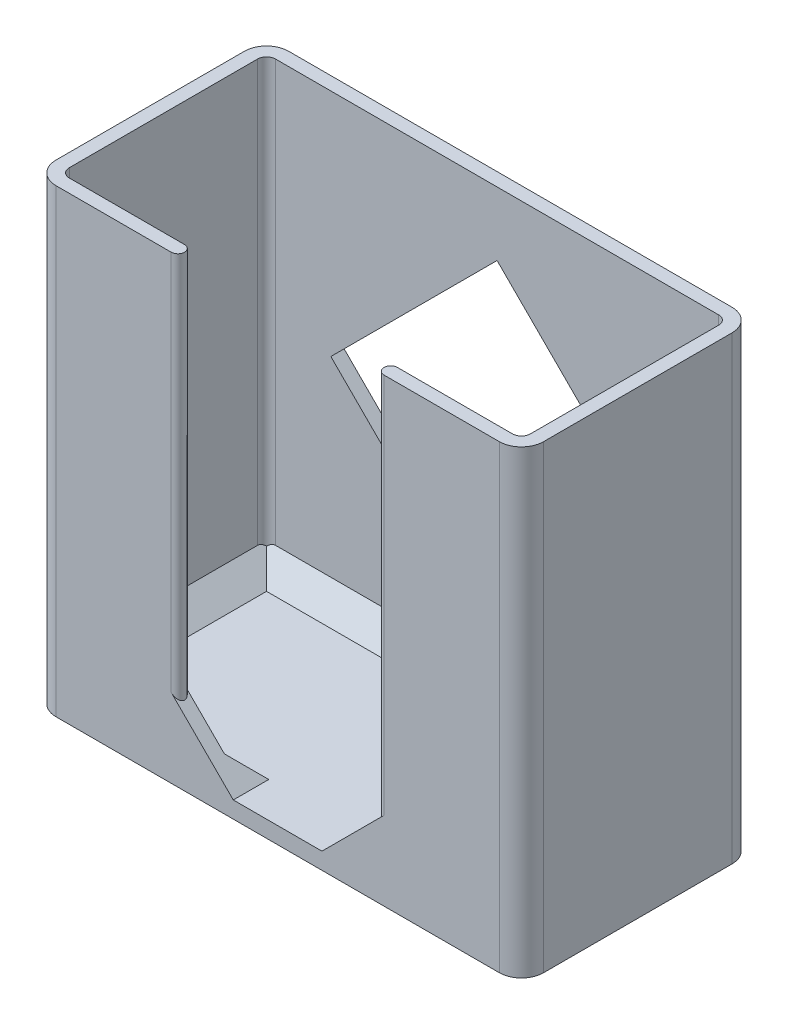
ISO-10303-21;
HEADER;
FILE_DESCRIPTION(('STEP AP214'),'2;1');
FILE_NAME('part.step','',(''),(''),'','','');
FILE_SCHEMA(('AUTOMOTIVE_DESIGN { 1 0 10303 214 1 1 1 1 }'));
ENDSEC;
DATA;
#1=APPLICATION_CONTEXT('core data for automotive mechanical design processes');
#2=APPLICATION_PROTOCOL_DEFINITION('international standard','automotive_design',2000,#1);
#3=PRODUCT_CONTEXT('',#1,'mechanical');
#4=PRODUCT('Part','Part','',(#3));
#5=PRODUCT_RELATED_PRODUCT_CATEGORY('part','',(#4));
#6=PRODUCT_DEFINITION_FORMATION('','',#4);
#7=PRODUCT_DEFINITION_CONTEXT('part definition',#1,'design');
#8=PRODUCT_DEFINITION('design','',#6,#7);
#9=PRODUCT_DEFINITION_SHAPE('','',#8);
#10=(LENGTH_UNIT() NAMED_UNIT(*) SI_UNIT(.MILLI.,.METRE.));
#11=(NAMED_UNIT(*) PLANE_ANGLE_UNIT() SI_UNIT($,.RADIAN.));
#12=(NAMED_UNIT(*) SI_UNIT($,.STERADIAN.) SOLID_ANGLE_UNIT());
#13=UNCERTAINTY_MEASURE_WITH_UNIT(LENGTH_MEASURE(1.E-05),#10,'distance_accuracy_value','');
#14=(GEOMETRIC_REPRESENTATION_CONTEXT(3) GLOBAL_UNCERTAINTY_ASSIGNED_CONTEXT((#13)) GLOBAL_UNIT_ASSIGNED_CONTEXT((#10,
#11,#12)) REPRESENTATION_CONTEXT('',''));
#15=CARTESIAN_POINT('',(0.,0.,0.));
#16=DIRECTION('',(0.,0.,1.));
#17=DIRECTION('',(1.,0.,0.));
#18=AXIS2_PLACEMENT_3D('',#15,#16,#17);
#19=CARTESIAN_POINT('',(9.6,3.49999999999999,9.9));
#20=DIRECTION('',(0.,-1.,0.));
#21=DIRECTION('',(0.,0.,-1.));
#22=AXIS2_PLACEMENT_3D('',#19,#20,#21);
#23=CYLINDRICAL_SURFACE('',#22,0.6);
#24=DIRECTION('',(0.,1.,0.));
#25=VECTOR('',#24,1.);
#26=CARTESIAN_POINT('',(9.6,3.49999999999999,9.3));
#27=LINE('',#26,#25);
#28=CARTESIAN_POINT('',(9.6,7.09999999999997,9.3));
#29=VERTEX_POINT('',#28);
#30=CARTESIAN_POINT('',(9.6,41.5,9.3));
#31=VERTEX_POINT('',#30);
#32=EDGE_CURVE('E470',#29,#31,#27,.T.);
#33=ORIENTED_EDGE('',*,*,#32,.F.);
#34=CARTESIAN_POINT('',(9.6,7.09999999999997,9.9));
#35=DIRECTION('',(-0.707106781186544,0.707106781186551,0.));
#36=DIRECTION('',(-0.707106781186551,-0.707106781186544,0.));
#37=AXIS2_PLACEMENT_3D('',#34,#35,#36);
#38=ELLIPSE('',#37,0.848528137423853,0.6);
#39=CARTESIAN_POINT('',(9.60000000000001,7.09999999999997,10.5));
#40=VERTEX_POINT('',#39);
#41=EDGE_CURVE('E11',#40,#29,#38,.F.);
#42=ORIENTED_EDGE('',*,*,#41,.F.);
#43=DIRECTION('',(0.,-1.,0.));
#44=VECTOR('',#43,1.);
#45=CARTESIAN_POINT('',(9.6,1.5,10.5));
#46=LINE('',#45,#44);
#47=CARTESIAN_POINT('',(9.6,41.5,10.5));
#48=VERTEX_POINT('',#47);
#49=EDGE_CURVE('E473',#48,#40,#46,.T.);
#50=ORIENTED_EDGE('',*,*,#49,.F.);
#51=CARTESIAN_POINT('',(9.6,41.5,9.9));
#52=DIRECTION('',(0.,-1.,0.));
#53=DIRECTION('',(0.,0.,-1.));
#54=AXIS2_PLACEMENT_3D('',#51,#52,#53);
#55=CIRCLE('',#54,0.6);
#56=EDGE_CURVE('E44',#31,#48,#55,.F.);
#57=ORIENTED_EDGE('',*,*,#56,.F.);
#58=EDGE_LOOP('',(#33,#42,#50,#57));
#59=FACE_BOUND('',#58,.T.);
#60=ADVANCED_FACE('F36',(#59),#23,.T.);
#61=CARTESIAN_POINT('',(-9.59999999999999,0.,9.9));
#62=DIRECTION('',(0.,1.,0.));
#63=DIRECTION('',(0.,0.,1.));
#64=AXIS2_PLACEMENT_3D('',#61,#62,#63);
#65=CYLINDRICAL_SURFACE('',#64,0.6);
#66=DIRECTION('',(0.,1.,0.));
#67=VECTOR('',#66,1.);
#68=CARTESIAN_POINT('',(-9.59999999999999,1.5,10.5));
#69=LINE('',#68,#67);
#70=CARTESIAN_POINT('',(-9.59999999999999,7.09999999999997,10.5));
#71=VERTEX_POINT('',#70);
#72=CARTESIAN_POINT('',(-9.59999999999999,41.5,10.5));
#73=VERTEX_POINT('',#72);
#74=EDGE_CURVE('E448',#71,#73,#69,.T.);
#75=ORIENTED_EDGE('',*,*,#74,.F.);
#76=CARTESIAN_POINT('',(-9.59999999999999,7.09999999999997,9.9));
#77=DIRECTION('',(0.707106781186544,0.707106781186551,0.));
#78=DIRECTION('',(-0.707106781186551,0.707106781186544,0.));
#79=AXIS2_PLACEMENT_3D('',#76,#77,#78);
#80=ELLIPSE('',#79,0.848528137423853,0.6);
#81=CARTESIAN_POINT('',(-9.59999999999999,7.09999999999997,9.3));
#82=VERTEX_POINT('',#81);
#83=EDGE_CURVE('E467',#82,#71,#80,.F.);
#84=ORIENTED_EDGE('',*,*,#83,.F.);
#85=DIRECTION('',(0.,-1.,0.));
#86=VECTOR('',#85,1.);
#87=CARTESIAN_POINT('',(-9.59999999999999,0.,9.3));
#88=LINE('',#87,#86);
#89=CARTESIAN_POINT('',(-9.59999999999999,41.5,9.3));
#90=VERTEX_POINT('',#89);
#91=EDGE_CURVE('E462',#90,#82,#88,.T.);
#92=ORIENTED_EDGE('',*,*,#91,.F.);
#93=CARTESIAN_POINT('',(-9.59999999999999,41.5,9.9));
#94=DIRECTION('',(0.,-1.,0.));
#95=DIRECTION('',(0.,0.,-1.));
#96=AXIS2_PLACEMENT_3D('',#93,#94,#95);
#97=CIRCLE('',#96,0.6);
#98=EDGE_CURVE('E465',#73,#90,#97,.F.);
#99=ORIENTED_EDGE('',*,*,#98,.F.);
#100=EDGE_LOOP('',(#75,#84,#92,#99));
#101=FACE_BOUND('',#100,.T.);
#102=ADVANCED_FACE('F503',(#101),#65,.T.);
#103=CARTESIAN_POINT('',(-20.,41.5,9.3));
#104=DIRECTION('',(0.,0.,-1.));
#105=DIRECTION('',(-1.,0.,0.));
#106=AXIS2_PLACEMENT_3D('',#103,#104,#105);
#107=PLANE('',#106);
#108=DIRECTION('',(-0.707106781186551,-0.707106781186544,0.));
#109=VECTOR('',#108,1.);
#110=CARTESIAN_POINT('',(3.99999999999998,1.5,9.3));
#111=LINE('',#110,#109);
#112=CARTESIAN_POINT('',(5.99999999999999,3.49999999999999,9.3));
#113=VERTEX_POINT('',#112);
#114=EDGE_CURVE('E402',#113,#29,#111,.F.);
#115=ORIENTED_EDGE('',*,*,#114,.T.);
#116=ORIENTED_EDGE('',*,*,#32,.T.);
#117=DIRECTION('',(1.,0.,0.));
#118=VECTOR('',#117,1.);
#119=CARTESIAN_POINT('',(-20.,41.5,9.3));
#120=LINE('',#119,#118);
#121=CARTESIAN_POINT('',(20.,41.5,9.3));
#122=VERTEX_POINT('',#121);
#123=EDGE_CURVE('E282',#31,#122,#120,.T.);
#124=ORIENTED_EDGE('',*,*,#123,.T.);
#125=DIRECTION('',(0.,-1.,0.));
#126=VECTOR('',#125,1.);
#127=CARTESIAN_POINT('',(20.,41.5,9.3));
#128=LINE('',#127,#126);
#129=CARTESIAN_POINT('',(20.,3.49999999999999,9.3));
#130=VERTEX_POINT('',#129);
#131=EDGE_CURVE('E307',#122,#130,#128,.T.);
#132=ORIENTED_EDGE('',*,*,#131,.T.);
#133=DIRECTION('',(-1.,0.,0.));
#134=VECTOR('',#133,1.);
#135=CARTESIAN_POINT('',(-20.,3.49999999999999,9.3));
#136=LINE('',#135,#134);
#137=EDGE_CURVE('E421',#130,#113,#136,.T.);
#138=ORIENTED_EDGE('',*,*,#137,.T.);
#139=EDGE_LOOP('',(#115,#116,#124,#132,#138));
#140=FACE_BOUND('',#139,.T.);
#141=ADVANCED_FACE('F549',(#140),#107,.T.);
#142=CARTESIAN_POINT('',(-20.,1.5,-8.5));
#143=DIRECTION('',(0.,-1.,0.));
#144=DIRECTION('',(0.,0.,-1.));
#145=AXIS2_PLACEMENT_3D('',#142,#143,#144);
#146=CYLINDRICAL_SURFACE('',#145,2.);
#147=CARTESIAN_POINT('',(-20.,0.,-8.5));
#148=DIRECTION('',(0.,1.,0.));
#149=DIRECTION('',(0.,0.,-1.));
#150=AXIS2_PLACEMENT_3D('',#147,#148,#149);
#151=CIRCLE('',#150,2.);
#152=CARTESIAN_POINT('',(-20.,0.,-10.5));
#153=VERTEX_POINT('',#152);
#154=CARTESIAN_POINT('',(-22.,0.,-8.5));
#155=VERTEX_POINT('',#154);
#156=EDGE_CURVE('E344',#153,#155,#151,.T.);
#157=ORIENTED_EDGE('',*,*,#156,.T.);
#158=DIRECTION('',(0.,-1.,0.));
#159=VECTOR('',#158,1.);
#160=CARTESIAN_POINT('',(-22.,1.5,-8.5));
#161=LINE('',#160,#159);
#162=CARTESIAN_POINT('',(-22.,41.5,-8.5));
#163=VERTEX_POINT('',#162);
#164=EDGE_CURVE('E382',#163,#155,#161,.T.);
#165=ORIENTED_EDGE('',*,*,#164,.F.);
#166=CARTESIAN_POINT('',(-20.,41.5,-8.5));
#167=DIRECTION('',(0.,1.,0.));
#168=DIRECTION('',(0.,0.,-1.));
#169=AXIS2_PLACEMENT_3D('',#166,#167,#168);
#170=CIRCLE('',#169,2.);
#171=CARTESIAN_POINT('',(-20.,41.5,-10.5));
#172=VERTEX_POINT('',#171);
#173=EDGE_CURVE('E325',#172,#163,#170,.T.);
#174=ORIENTED_EDGE('',*,*,#173,.F.);
#175=DIRECTION('',(0.,-1.,0.));
#176=VECTOR('',#175,1.);
#177=CARTESIAN_POINT('',(-20.,1.5,-10.5));
#178=LINE('',#177,#176);
#179=EDGE_CURVE('E361',#172,#153,#178,.T.);
#180=ORIENTED_EDGE('',*,*,#179,.T.);
#181=EDGE_LOOP('',(#157,#165,#174,#180));
#182=FACE_BOUND('',#181,.T.);
#183=ADVANCED_FACE('F531',(#182),#146,.T.);
#184=CARTESIAN_POINT('',(-22.,1.5,8.5));
#185=DIRECTION('',(1.,0.,0.));
#186=DIRECTION('',(0.,0.,-1.));
#187=AXIS2_PLACEMENT_3D('',#184,#185,#186);
#188=PLANE('',#187);
#189=DIRECTION('',(0.,0.,1.));
#190=VECTOR('',#189,1.);
#191=CARTESIAN_POINT('',(-22.,0.,8.5));
#192=LINE('',#191,#190);
#193=CARTESIAN_POINT('',(-22.,0.,8.5));
#194=VERTEX_POINT('',#193);
#195=EDGE_CURVE('E347',#155,#194,#192,.T.);
#196=ORIENTED_EDGE('',*,*,#195,.T.);
#197=DIRECTION('',(0.,-1.,0.));
#198=VECTOR('',#197,1.);
#199=CARTESIAN_POINT('',(-22.,1.5,8.5));
#200=LINE('',#199,#198);
#201=CARTESIAN_POINT('',(-22.,41.5,8.5));
#202=VERTEX_POINT('',#201);
#203=EDGE_CURVE('E379',#202,#194,#200,.T.);
#204=ORIENTED_EDGE('',*,*,#203,.F.);
#205=DIRECTION('',(0.,0.,1.));
#206=VECTOR('',#205,1.);
#207=CARTESIAN_POINT('',(-22.,41.5,8.5));
#208=LINE('',#207,#206);
#209=EDGE_CURVE('E328',#163,#202,#208,.T.);
#210=ORIENTED_EDGE('',*,*,#209,.F.);
#211=ORIENTED_EDGE('',*,*,#164,.T.);
#212=EDGE_LOOP('',(#196,#204,#210,#211));
#213=FACE_BOUND('',#212,.T.);
#214=ADVANCED_FACE('F533',(#213),#188,.F.);
#215=CARTESIAN_POINT('',(-20.,1.5,8.5));
#216=DIRECTION('',(0.,-1.,0.));
#217=DIRECTION('',(0.,0.,-1.));
#218=AXIS2_PLACEMENT_3D('',#215,#216,#217);
#219=CYLINDRICAL_SURFACE('',#218,2.);
#220=CARTESIAN_POINT('',(-20.,0.,8.5));
#221=DIRECTION('',(0.,1.,0.));
#222=DIRECTION('',(0.,0.,-1.));
#223=AXIS2_PLACEMENT_3D('',#220,#221,#222);
#224=CIRCLE('',#223,2.);
#225=CARTESIAN_POINT('',(-20.,0.,10.5));
#226=VERTEX_POINT('',#225);
#227=EDGE_CURVE('E349',#194,#226,#224,.T.);
#228=ORIENTED_EDGE('',*,*,#227,.T.);
#229=DIRECTION('',(0.,-1.,0.));
#230=VECTOR('',#229,1.);
#231=CARTESIAN_POINT('',(-20.,1.5,10.5));
#232=LINE('',#231,#230);
#233=CARTESIAN_POINT('',(-20.,41.5,10.5));
#234=VERTEX_POINT('',#233);
#235=EDGE_CURVE('E376',#234,#226,#232,.T.);
#236=ORIENTED_EDGE('',*,*,#235,.F.);
#237=CARTESIAN_POINT('',(-20.,41.5,8.5));
#238=DIRECTION('',(0.,1.,0.));
#239=DIRECTION('',(0.,0.,-1.));
#240=AXIS2_PLACEMENT_3D('',#237,#238,#239);
#241=CIRCLE('',#240,2.);
#242=EDGE_CURVE('E331',#202,#234,#241,.T.);
#243=ORIENTED_EDGE('',*,*,#242,.F.);
#244=ORIENTED_EDGE('',*,*,#203,.T.);
#245=EDGE_LOOP('',(#228,#236,#243,#244));
#246=FACE_BOUND('',#245,.T.);
#247=ADVANCED_FACE('F534',(#246),#219,.T.);
#248=CARTESIAN_POINT('',(-20.,1.5,10.5));
#249=DIRECTION('',(0.,0.,-1.));
#250=DIRECTION('',(-1.,0.,0.));
#251=AXIS2_PLACEMENT_3D('',#248,#249,#250);
#252=PLANE('',#251);
#253=DIRECTION('',(1.,0.,0.));
#254=VECTOR('',#253,1.);
#255=CARTESIAN_POINT('',(-20.,41.5,10.5));
#256=LINE('',#255,#254);
#257=CARTESIAN_POINT('',(20.,41.5,10.5));
#258=VERTEX_POINT('',#257);
#259=EDGE_CURVE('E334',#48,#258,#256,.T.);
#260=ORIENTED_EDGE('',*,*,#259,.F.);
#261=ORIENTED_EDGE('',*,*,#49,.T.);
#262=DIRECTION('',(0.707106781186551,0.707106781186544,0.));
#263=VECTOR('',#262,1.);
#264=CARTESIAN_POINT('',(-8.00000000000012,-10.5,10.5));
#265=LINE('',#264,#263);
#266=CARTESIAN_POINT('',(3.99999999999998,1.5,10.5));
#267=VERTEX_POINT('',#266);
#268=EDGE_CURVE('E50',#40,#267,#265,.F.);
#269=ORIENTED_EDGE('',*,*,#268,.T.);
#270=DIRECTION('',(-1.,0.,0.));
#271=VECTOR('',#270,1.);
#272=CARTESIAN_POINT('',(-20.,1.5,10.5));
#273=LINE('',#272,#271);
#274=CARTESIAN_POINT('',(-3.99999999999997,1.5,10.5));
#275=VERTEX_POINT('',#274);
#276=EDGE_CURVE('E271',#267,#275,#273,.T.);
#277=ORIENTED_EDGE('',*,*,#276,.T.);
#278=DIRECTION('',(0.707106781186551,-0.707106781186544,0.));
#279=VECTOR('',#278,1.);
#280=CARTESIAN_POINT('',(-12.0000000000001,9.50000000000001,10.5));
#281=LINE('',#280,#279);
#282=EDGE_CURVE('E397',#275,#71,#281,.F.);
#283=ORIENTED_EDGE('',*,*,#282,.T.);
#284=ORIENTED_EDGE('',*,*,#74,.T.);
#285=EDGE_CURVE('E335',#234,#73,#256,.T.);
#286=ORIENTED_EDGE('',*,*,#285,.F.);
#287=ORIENTED_EDGE('',*,*,#235,.T.);
#288=DIRECTION('',(1.,0.,0.));
#289=VECTOR('',#288,1.);
#290=CARTESIAN_POINT('',(-20.,0.,10.5));
#291=LINE('',#290,#289);
#292=CARTESIAN_POINT('',(20.,0.,10.5));
#293=VERTEX_POINT('',#292);
#294=EDGE_CURVE('E351',#226,#293,#291,.T.);
#295=ORIENTED_EDGE('',*,*,#294,.T.);
#296=DIRECTION('',(0.,-1.,0.));
#297=VECTOR('',#296,1.);
#298=CARTESIAN_POINT('',(20.,1.5,10.5));
#299=LINE('',#298,#297);
#300=EDGE_CURVE('E373',#258,#293,#299,.T.);
#301=ORIENTED_EDGE('',*,*,#300,.F.);
#302=EDGE_LOOP('',(#260,#261,#269,#277,#283,#284,#286,#287,#295,#301));
#303=FACE_BOUND('',#302,.T.);
#304=ADVANCED_FACE('F477',(#303),#252,.F.);
#305=CARTESIAN_POINT('',(20.,1.5,8.5));
#306=DIRECTION('',(0.,-1.,0.));
#307=DIRECTION('',(0.,0.,-1.));
#308=AXIS2_PLACEMENT_3D('',#305,#306,#307);
#309=CYLINDRICAL_SURFACE('',#308,2.);
#310=CARTESIAN_POINT('',(20.,0.,8.5));
#311=DIRECTION('',(0.,1.,0.));
#312=DIRECTION('',(0.,0.,1.));
#313=AXIS2_PLACEMENT_3D('',#310,#311,#312);
#314=CIRCLE('',#313,2.);
#315=CARTESIAN_POINT('',(22.,0.,8.5));
#316=VERTEX_POINT('',#315);
#317=EDGE_CURVE('E353',#293,#316,#314,.T.);
#318=ORIENTED_EDGE('',*,*,#317,.T.);
#319=DIRECTION('',(0.,-1.,0.));
#320=VECTOR('',#319,1.);
#321=CARTESIAN_POINT('',(22.,1.5,8.5));
#322=LINE('',#321,#320);
#323=CARTESIAN_POINT('',(22.,41.5,8.5));
#324=VERTEX_POINT('',#323);
#325=EDGE_CURVE('E370',#324,#316,#322,.T.);
#326=ORIENTED_EDGE('',*,*,#325,.F.);
#327=CARTESIAN_POINT('',(20.,41.5,8.5));
#328=DIRECTION('',(0.,1.,0.));
#329=DIRECTION('',(0.,0.,-1.));
#330=AXIS2_PLACEMENT_3D('',#327,#328,#329);
#331=CIRCLE('',#330,2.);
#332=EDGE_CURVE('E338',#258,#324,#331,.T.);
#333=ORIENTED_EDGE('',*,*,#332,.F.);
#334=ORIENTED_EDGE('',*,*,#300,.T.);
#335=EDGE_LOOP('',(#318,#326,#333,#334));
#336=FACE_BOUND('',#335,.T.);
#337=ADVANCED_FACE('F518',(#336),#309,.T.);
#338=CARTESIAN_POINT('',(22.,1.5,8.5));
#339=DIRECTION('',(-1.,0.,0.));
#340=DIRECTION('',(0.,0.,1.));
#341=AXIS2_PLACEMENT_3D('',#338,#339,#340);
#342=PLANE('',#341);
#343=DIRECTION('',(0.,0.,-1.));
#344=VECTOR('',#343,1.);
#345=CARTESIAN_POINT('',(22.,0.,8.5));
#346=LINE('',#345,#344);
#347=CARTESIAN_POINT('',(22.,0.,-8.5));
#348=VERTEX_POINT('',#347);
#349=EDGE_CURVE('E355',#316,#348,#346,.T.);
#350=ORIENTED_EDGE('',*,*,#349,.T.);
#351=DIRECTION('',(0.,-1.,0.));
#352=VECTOR('',#351,1.);
#353=CARTESIAN_POINT('',(22.,1.5,-8.5));
#354=LINE('',#353,#352);
#355=CARTESIAN_POINT('',(22.,41.5,-8.5));
#356=VERTEX_POINT('',#355);
#357=EDGE_CURVE('E367',#356,#348,#354,.T.);
#358=ORIENTED_EDGE('',*,*,#357,.F.);
#359=DIRECTION('',(0.,0.,-1.));
#360=VECTOR('',#359,1.);
#361=CARTESIAN_POINT('',(22.,41.5,8.5));
#362=LINE('',#361,#360);
#363=EDGE_CURVE('E341',#324,#356,#362,.T.);
#364=ORIENTED_EDGE('',*,*,#363,.F.);
#365=ORIENTED_EDGE('',*,*,#325,.T.);
#366=EDGE_LOOP('',(#350,#358,#364,#365));
#367=FACE_BOUND('',#366,.T.);
#368=ADVANCED_FACE('F522',(#367),#342,.F.);
#369=CARTESIAN_POINT('',(20.,1.5,-8.5));
#370=DIRECTION('',(0.,-1.,0.));
#371=DIRECTION('',(0.,0.,-1.));
#372=AXIS2_PLACEMENT_3D('',#369,#370,#371);
#373=CYLINDRICAL_SURFACE('',#372,2.);
#374=CARTESIAN_POINT('',(20.,0.,-8.5));
#375=DIRECTION('',(0.,1.,0.));
#376=DIRECTION('',(0.,0.,1.));
#377=AXIS2_PLACEMENT_3D('',#374,#375,#376);
#378=CIRCLE('',#377,2.);
#379=CARTESIAN_POINT('',(20.,0.,-10.5));
#380=VERTEX_POINT('',#379);
#381=EDGE_CURVE('E357',#348,#380,#378,.T.);
#382=ORIENTED_EDGE('',*,*,#381,.T.);
#383=DIRECTION('',(0.,-1.,0.));
#384=VECTOR('',#383,1.);
#385=CARTESIAN_POINT('',(20.,1.5,-10.5));
#386=LINE('',#385,#384);
#387=CARTESIAN_POINT('',(20.,41.5,-10.5));
#388=VERTEX_POINT('',#387);
#389=EDGE_CURVE('E364',#388,#380,#386,.T.);
#390=ORIENTED_EDGE('',*,*,#389,.F.);
#391=CARTESIAN_POINT('',(20.,41.5,-8.5));
#392=DIRECTION('',(0.,1.,0.));
#393=DIRECTION('',(0.,0.,-1.));
#394=AXIS2_PLACEMENT_3D('',#391,#392,#393);
#395=CIRCLE('',#394,2.);
#396=EDGE_CURVE('E319',#356,#388,#395,.T.);
#397=ORIENTED_EDGE('',*,*,#396,.F.);
#398=ORIENTED_EDGE('',*,*,#357,.T.);
#399=EDGE_LOOP('',(#382,#390,#397,#398));
#400=FACE_BOUND('',#399,.T.);
#401=ADVANCED_FACE('F525',(#400),#373,.T.);
#402=CARTESIAN_POINT('',(-20.,1.5,-10.5));
#403=DIRECTION('',(0.,0.,1.));
#404=DIRECTION('',(1.,0.,0.));
#405=AXIS2_PLACEMENT_3D('',#402,#403,#404);
#406=PLANE('',#405);
#407=DIRECTION('',(-0.707106781186548,0.707106781186547,0.));
#408=VECTOR('',#407,1.);
#409=CARTESIAN_POINT('',(0.,5.74999999999989,-10.5));
#410=LINE('',#409,#408);
#411=CARTESIAN_POINT('',(0.,5.74999999999989,-10.5));
#412=VERTEX_POINT('',#411);
#413=CARTESIAN_POINT('',(-15.0000000000002,20.75,-10.5));
#414=VERTEX_POINT('',#413);
#415=EDGE_CURVE('E254',#412,#414,#410,.T.);
#416=ORIENTED_EDGE('',*,*,#415,.F.);
#417=DIRECTION('',(-0.707106781186548,-0.707106781186547,0.));
#418=VECTOR('',#417,1.);
#419=CARTESIAN_POINT('',(15.0000000000002,20.75,-10.5));
#420=LINE('',#419,#418);
#421=CARTESIAN_POINT('',(15.0000000000002,20.75,-10.5));
#422=VERTEX_POINT('',#421);
#423=EDGE_CURVE('E259',#422,#412,#420,.T.);
#424=ORIENTED_EDGE('',*,*,#423,.F.);
#425=DIRECTION('',(0.707106781186547,-0.707106781186548,0.));
#426=VECTOR('',#425,1.);
#427=CARTESIAN_POINT('',(0.,35.7500000000002,-10.5));
#428=LINE('',#427,#426);
#429=CARTESIAN_POINT('',(0.,35.7500000000002,-10.5));
#430=VERTEX_POINT('',#429);
#431=EDGE_CURVE('E264',#430,#422,#428,.T.);
#432=ORIENTED_EDGE('',*,*,#431,.F.);
#433=DIRECTION('',(0.707106781186548,0.707106781186547,0.));
#434=VECTOR('',#433,1.);
#435=CARTESIAN_POINT('',(-15.0000000000002,20.75,-10.5));
#436=LINE('',#435,#434);
#437=EDGE_CURVE('E243',#414,#430,#436,.T.);
#438=ORIENTED_EDGE('',*,*,#437,.F.);
#439=EDGE_LOOP('',(#416,#424,#432,#438));
#440=FACE_BOUND('',#439,.T.);
#441=DIRECTION('',(-1.,0.,0.));
#442=VECTOR('',#441,1.);
#443=CARTESIAN_POINT('',(-20.,0.,-10.5));
#444=LINE('',#443,#442);
#445=EDGE_CURVE('E359',#380,#153,#444,.T.);
#446=ORIENTED_EDGE('',*,*,#445,.T.);
#447=ORIENTED_EDGE('',*,*,#179,.F.);
#448=DIRECTION('',(-1.,0.,0.));
#449=VECTOR('',#448,1.);
#450=CARTESIAN_POINT('',(-20.,41.5,-10.5));
#451=LINE('',#450,#449);
#452=EDGE_CURVE('E322',#388,#172,#451,.T.);
#453=ORIENTED_EDGE('',*,*,#452,.F.);
#454=ORIENTED_EDGE('',*,*,#389,.T.);
#455=EDGE_LOOP('',(#446,#447,#453,#454));
#456=FACE_BOUND('',#455,.T.);
#457=ADVANCED_FACE('F261',(#440,#456),#406,.F.);
#458=CARTESIAN_POINT('',(-20.,0.,-8.5));
#459=DIRECTION('',(0.,-1.,0.));
#460=DIRECTION('',(0.,0.,-1.));
#461=AXIS2_PLACEMENT_3D('',#458,#459,#460);
#462=PLANE('',#461);
#463=ORIENTED_EDGE('',*,*,#156,.F.);
#464=ORIENTED_EDGE('',*,*,#445,.F.);
#465=ORIENTED_EDGE('',*,*,#381,.F.);
#466=ORIENTED_EDGE('',*,*,#349,.F.);
#467=ORIENTED_EDGE('',*,*,#317,.F.);
#468=ORIENTED_EDGE('',*,*,#294,.F.);
#469=ORIENTED_EDGE('',*,*,#227,.F.);
#470=ORIENTED_EDGE('',*,*,#195,.F.);
#471=EDGE_LOOP('',(#463,#464,#465,#466,#467,#468,#469,#470));
#472=FACE_BOUND('',#471,.T.);
#473=ADVANCED_FACE('F514',(#472),#462,.T.);
#474=CARTESIAN_POINT('',(20.,41.5,-8.5));
#475=DIRECTION('',(0.,-1.,0.));
#476=DIRECTION('',(0.,0.,-1.));
#477=AXIS2_PLACEMENT_3D('',#474,#475,#476);
#478=PLANE('',#477);
#479=ORIENTED_EDGE('',*,*,#123,.F.);
#480=ORIENTED_EDGE('',*,*,#56,.T.);
#481=ORIENTED_EDGE('',*,*,#259,.T.);
#482=ORIENTED_EDGE('',*,*,#332,.T.);
#483=ORIENTED_EDGE('',*,*,#363,.T.);
#484=ORIENTED_EDGE('',*,*,#396,.T.);
#485=ORIENTED_EDGE('',*,*,#452,.T.);
#486=ORIENTED_EDGE('',*,*,#173,.T.);
#487=ORIENTED_EDGE('',*,*,#209,.T.);
#488=ORIENTED_EDGE('',*,*,#242,.T.);
#489=ORIENTED_EDGE('',*,*,#285,.T.);
#490=ORIENTED_EDGE('',*,*,#98,.T.);
#491=CARTESIAN_POINT('',(-20.,41.5,9.3));
#492=VERTEX_POINT('',#491);
#493=EDGE_CURVE('E283',#492,#90,#120,.T.);
#494=ORIENTED_EDGE('',*,*,#493,.F.);
#495=CARTESIAN_POINT('',(-20.,41.5,8.5));
#496=DIRECTION('',(0.,1.,0.));
#497=DIRECTION('',(0.,0.,-1.));
#498=AXIS2_PLACEMENT_3D('',#495,#496,#497);
#499=CIRCLE('',#498,0.800000000000001);
#500=CARTESIAN_POINT('',(-20.8,41.5,8.5));
#501=VERTEX_POINT('',#500);
#502=EDGE_CURVE('E280',#501,#492,#499,.T.);
#503=ORIENTED_EDGE('',*,*,#502,.F.);
#504=DIRECTION('',(0.,0.,1.));
#505=VECTOR('',#504,1.);
#506=CARTESIAN_POINT('',(-20.8,41.5,8.5));
#507=LINE('',#506,#505);
#508=CARTESIAN_POINT('',(-20.8,41.5,-8.5));
#509=VERTEX_POINT('',#508);
#510=EDGE_CURVE('E278',#509,#501,#507,.T.);
#511=ORIENTED_EDGE('',*,*,#510,.F.);
#512=CARTESIAN_POINT('',(-20.,41.5,-8.5));
#513=DIRECTION('',(0.,1.,0.));
#514=DIRECTION('',(0.,0.,-1.));
#515=AXIS2_PLACEMENT_3D('',#512,#513,#514);
#516=CIRCLE('',#515,0.800000000000001);
#517=CARTESIAN_POINT('',(-20.,41.5,-9.3));
#518=VERTEX_POINT('',#517);
#519=EDGE_CURVE('E276',#518,#509,#516,.T.);
#520=ORIENTED_EDGE('',*,*,#519,.F.);
#521=DIRECTION('',(-1.,0.,0.));
#522=VECTOR('',#521,1.);
#523=CARTESIAN_POINT('',(-20.,41.5,-9.3));
#524=LINE('',#523,#522);
#525=CARTESIAN_POINT('',(20.,41.5,-9.3));
#526=VERTEX_POINT('',#525);
#527=EDGE_CURVE('E293',#526,#518,#524,.T.);
#528=ORIENTED_EDGE('',*,*,#527,.F.);
#529=CARTESIAN_POINT('',(20.,41.5,-8.5));
#530=DIRECTION('',(0.,1.,0.));
#531=DIRECTION('',(0.,0.,-1.));
#532=AXIS2_PLACEMENT_3D('',#529,#530,#531);
#533=CIRCLE('',#532,0.800000000000001);
#534=CARTESIAN_POINT('',(20.8,41.5,-8.5));
#535=VERTEX_POINT('',#534);
#536=EDGE_CURVE('E290',#535,#526,#533,.T.);
#537=ORIENTED_EDGE('',*,*,#536,.F.);
#538=DIRECTION('',(0.,0.,-1.));
#539=VECTOR('',#538,1.);
#540=CARTESIAN_POINT('',(20.8,41.5,8.5));
#541=LINE('',#540,#539);
#542=CARTESIAN_POINT('',(20.8,41.5,8.5));
#543=VERTEX_POINT('',#542);
#544=EDGE_CURVE('E288',#543,#535,#541,.T.);
#545=ORIENTED_EDGE('',*,*,#544,.F.);
#546=CARTESIAN_POINT('',(20.,41.5,8.5));
#547=DIRECTION('',(0.,1.,0.));
#548=DIRECTION('',(0.,0.,-1.));
#549=AXIS2_PLACEMENT_3D('',#546,#547,#548);
#550=CIRCLE('',#549,0.800000000000001);
#551=EDGE_CURVE('E286',#122,#543,#550,.T.);
#552=ORIENTED_EDGE('',*,*,#551,.F.);
#553=EDGE_LOOP('',(#479,#480,#481,#482,#483,#484,#485,#486,#487,#488,#489,#490,#494,#503,#511,
#520,#528,#537,#545,#552));
#554=FACE_BOUND('',#553,.T.);
#555=ADVANCED_FACE('F505',(#554),#478,.F.);
#556=CARTESIAN_POINT('',(-20.,41.5,-8.5));
#557=DIRECTION('',(0.,-1.,0.));
#558=DIRECTION('',(0.,0.,-1.));
#559=AXIS2_PLACEMENT_3D('',#556,#557,#558);
#560=CYLINDRICAL_SURFACE('',#559,0.800000000000001);
#561=DIRECTION('',(0.,-1.,0.));
#562=VECTOR('',#561,1.);
#563=CARTESIAN_POINT('',(-20.8,41.5,-8.5));
#564=LINE('',#563,#562);
#565=CARTESIAN_POINT('',(-20.8,3.5,-8.5));
#566=VERTEX_POINT('',#565);
#567=EDGE_CURVE('E316',#509,#566,#564,.T.);
#568=ORIENTED_EDGE('',*,*,#567,.T.);
#569=CARTESIAN_POINT('',(-20.,2.70000000000001,-8.5));
#570=DIRECTION('',(-0.707106781186544,-0.707106781186551,0.));
#571=DIRECTION('',(0.707106781186551,-0.707106781186544,0.));
#572=AXIS2_PLACEMENT_3D('',#569,#570,#571);
#573=ELLIPSE('',#572,1.13137084989847,0.800000000000001);
#574=CARTESIAN_POINT('',(-20.5656854249492,3.26568542494924,-9.06568542494924));
#575=VERTEX_POINT('',#574);
#576=EDGE_CURVE('E439',#566,#575,#573,.T.);
#577=ORIENTED_EDGE('',*,*,#576,.T.);
#578=CARTESIAN_POINT('',(-20.,2.7,-8.5));
#579=DIRECTION('',(0.,-0.707106781186552,-0.707106781186543));
#580=DIRECTION('',(0.,-0.707106781186543,0.707106781186552));
#581=AXIS2_PLACEMENT_3D('',#578,#579,#580);
#582=ELLIPSE('',#581,1.13137084989847,0.800000000000001);
#583=CARTESIAN_POINT('',(-20.,3.49999999999999,-9.3));
#584=VERTEX_POINT('',#583);
#585=EDGE_CURVE('E437',#575,#584,#582,.T.);
#586=ORIENTED_EDGE('',*,*,#585,.T.);
#587=DIRECTION('',(0.,-1.,0.));
#588=VECTOR('',#587,1.);
#589=CARTESIAN_POINT('',(-20.,41.5,-9.3));
#590=LINE('',#589,#588);
#591=EDGE_CURVE('E295',#518,#584,#590,.T.);
#592=ORIENTED_EDGE('',*,*,#591,.F.);
#593=ORIENTED_EDGE('',*,*,#519,.T.);
#594=EDGE_LOOP('',(#568,#577,#586,#592,#593));
#595=FACE_BOUND('',#594,.T.);
#596=ADVANCED_FACE('F681',(#595),#560,.F.);
#597=CARTESIAN_POINT('',(-20.8,41.5,8.5));
#598=DIRECTION('',(1.,0.,0.));
#599=DIRECTION('',(0.,0.,-1.));
#600=AXIS2_PLACEMENT_3D('',#597,#598,#599);
#601=PLANE('',#600);
#602=DIRECTION('',(0.,-1.,0.));
#603=VECTOR('',#602,1.);
#604=CARTESIAN_POINT('',(-20.8,41.5,8.5));
#605=LINE('',#604,#603);
#606=CARTESIAN_POINT('',(-20.8,3.5,8.5));
#607=VERTEX_POINT('',#606);
#608=EDGE_CURVE('E313',#501,#607,#605,.T.);
#609=ORIENTED_EDGE('',*,*,#608,.T.);
#610=DIRECTION('',(0.,0.,-1.));
#611=VECTOR('',#610,1.);
#612=CARTESIAN_POINT('',(-20.8,3.5,8.5));
#613=LINE('',#612,#611);
#614=EDGE_CURVE('E435',#607,#566,#613,.T.);
#615=ORIENTED_EDGE('',*,*,#614,.T.);
#616=ORIENTED_EDGE('',*,*,#567,.F.);
#617=ORIENTED_EDGE('',*,*,#510,.T.);
#618=EDGE_LOOP('',(#609,#615,#616,#617));
#619=FACE_BOUND('',#618,.T.);
#620=ADVANCED_FACE('F686',(#619),#601,.T.);
#621=CARTESIAN_POINT('',(-20.,41.5,8.5));
#622=DIRECTION('',(0.,-1.,0.));
#623=DIRECTION('',(0.,0.,-1.));
#624=AXIS2_PLACEMENT_3D('',#621,#622,#623);
#625=CYLINDRICAL_SURFACE('',#624,0.800000000000001);
#626=DIRECTION('',(0.,-1.,0.));
#627=VECTOR('',#626,1.);
#628=CARTESIAN_POINT('',(-20.,41.5,9.3));
#629=LINE('',#628,#627);
#630=CARTESIAN_POINT('',(-20.,3.49999999999999,9.3));
#631=VERTEX_POINT('',#630);
#632=EDGE_CURVE('E310',#492,#631,#629,.T.);
#633=ORIENTED_EDGE('',*,*,#632,.T.);
#634=CARTESIAN_POINT('',(-20.,2.7,8.5));
#635=DIRECTION('',(0.,-0.707106781186552,0.707106781186543));
#636=DIRECTION('',(0.,-0.707106781186543,-0.707106781186552));
#637=AXIS2_PLACEMENT_3D('',#634,#635,#636);
#638=ELLIPSE('',#637,1.13137084989847,0.800000000000001);
#639=CARTESIAN_POINT('',(-20.5656854249492,3.26568542494924,9.06568542494925));
#640=VERTEX_POINT('',#639);
#641=EDGE_CURVE('E433',#631,#640,#638,.T.);
#642=ORIENTED_EDGE('',*,*,#641,.T.);
#643=CARTESIAN_POINT('',(-20.,2.70000000000001,8.5));
#644=DIRECTION('',(-0.707106781186544,-0.707106781186551,0.));
#645=DIRECTION('',(0.707106781186551,-0.707106781186544,0.));
#646=AXIS2_PLACEMENT_3D('',#643,#644,#645);
#647=ELLIPSE('',#646,1.13137084989847,0.800000000000001);
#648=EDGE_CURVE('E431',#640,#607,#647,.T.);
#649=ORIENTED_EDGE('',*,*,#648,.T.);
#650=ORIENTED_EDGE('',*,*,#608,.F.);
#651=ORIENTED_EDGE('',*,*,#502,.T.);
#652=EDGE_LOOP('',(#633,#642,#649,#650,#651));
#653=FACE_BOUND('',#652,.T.);
#654=ADVANCED_FACE('F697',(#653),#625,.F.);
#655=ORIENTED_EDGE('',*,*,#493,.T.);
#656=ORIENTED_EDGE('',*,*,#91,.T.);
#657=DIRECTION('',(-0.707106781186551,0.707106781186544,0.));
#658=VECTOR('',#657,1.);
#659=CARTESIAN_POINT('',(-3.99999999999997,1.5,9.3));
#660=LINE('',#659,#658);
#661=CARTESIAN_POINT('',(-5.99999999999998,3.49999999999999,9.3));
#662=VERTEX_POINT('',#661);
#663=EDGE_CURVE('E399',#82,#662,#660,.F.);
#664=ORIENTED_EDGE('',*,*,#663,.T.);
#665=DIRECTION('',(-1.,0.,0.));
#666=VECTOR('',#665,1.);
#667=CARTESIAN_POINT('',(-20.,3.49999999999999,9.3));
#668=LINE('',#667,#666);
#669=EDGE_CURVE('E429',#662,#631,#668,.T.);
#670=ORIENTED_EDGE('',*,*,#669,.T.);
#671=ORIENTED_EDGE('',*,*,#632,.F.);
#672=EDGE_LOOP('',(#655,#656,#664,#670,#671));
#673=FACE_BOUND('',#672,.T.);
#674=ADVANCED_FACE('F554',(#673),#107,.T.);
#675=CARTESIAN_POINT('',(20.,41.5,8.5));
#676=DIRECTION('',(0.,-1.,0.));
#677=DIRECTION('',(0.,0.,-1.));
#678=AXIS2_PLACEMENT_3D('',#675,#676,#677);
#679=CYLINDRICAL_SURFACE('',#678,0.800000000000001);
#680=CARTESIAN_POINT('',(20.,2.70000000000001,8.5));
#681=DIRECTION('',(0.707106781186544,-0.707106781186551,0.));
#682=DIRECTION('',(-0.707106781186551,-0.707106781186544,0.));
#683=AXIS2_PLACEMENT_3D('',#680,#681,#682);
#684=ELLIPSE('',#683,1.13137084989847,0.800000000000001);
#685=CARTESIAN_POINT('',(20.8,3.5,8.5));
#686=VERTEX_POINT('',#685);
#687=CARTESIAN_POINT('',(20.5656854249492,3.26568542494924,9.06568542494925));
#688=VERTEX_POINT('',#687);
#689=EDGE_CURVE('E417',#686,#688,#684,.T.);
#690=ORIENTED_EDGE('',*,*,#689,.T.);
#691=CARTESIAN_POINT('',(20.,2.7,8.5));
#692=DIRECTION('',(0.,-0.707106781186552,0.707106781186543));
#693=DIRECTION('',(0.,-0.707106781186543,-0.707106781186552));
#694=AXIS2_PLACEMENT_3D('',#691,#692,#693);
#695=ELLIPSE('',#694,1.13137084989847,0.800000000000001);
#696=EDGE_CURVE('E419',#688,#130,#695,.T.);
#697=ORIENTED_EDGE('',*,*,#696,.T.);
#698=ORIENTED_EDGE('',*,*,#131,.F.);
#699=ORIENTED_EDGE('',*,*,#551,.T.);
#700=DIRECTION('',(0.,-1.,0.));
#701=VECTOR('',#700,1.);
#702=CARTESIAN_POINT('',(20.8,41.5,8.5));
#703=LINE('',#702,#701);
#704=EDGE_CURVE('E304',#543,#686,#703,.T.);
#705=ORIENTED_EDGE('',*,*,#704,.T.);
#706=EDGE_LOOP('',(#690,#697,#698,#699,#705));
#707=FACE_BOUND('',#706,.T.);
#708=ADVANCED_FACE('F714',(#707),#679,.F.);
#709=CARTESIAN_POINT('',(20.8,41.5,8.5));
#710=DIRECTION('',(-1.,0.,0.));
#711=DIRECTION('',(0.,0.,1.));
#712=AXIS2_PLACEMENT_3D('',#709,#710,#711);
#713=PLANE('',#712);
#714=DIRECTION('',(0.,-1.,0.));
#715=VECTOR('',#714,1.);
#716=CARTESIAN_POINT('',(20.8,41.5,-8.5));
#717=LINE('',#716,#715);
#718=CARTESIAN_POINT('',(20.8,3.5,-8.5));
#719=VERTEX_POINT('',#718);
#720=EDGE_CURVE('E301',#535,#719,#717,.T.);
#721=ORIENTED_EDGE('',*,*,#720,.T.);
#722=DIRECTION('',(0.,0.,1.));
#723=VECTOR('',#722,1.);
#724=CARTESIAN_POINT('',(20.8,3.5,8.5));
#725=LINE('',#724,#723);
#726=EDGE_CURVE('E427',#719,#686,#725,.T.);
#727=ORIENTED_EDGE('',*,*,#726,.T.);
#728=ORIENTED_EDGE('',*,*,#704,.F.);
#729=ORIENTED_EDGE('',*,*,#544,.T.);
#730=EDGE_LOOP('',(#721,#727,#728,#729));
#731=FACE_BOUND('',#730,.T.);
#732=ADVANCED_FACE('F719',(#731),#713,.T.);
#733=CARTESIAN_POINT('',(20.,41.5,-8.5));
#734=DIRECTION('',(0.,-1.,0.));
#735=DIRECTION('',(0.,0.,-1.));
#736=AXIS2_PLACEMENT_3D('',#733,#734,#735);
#737=CYLINDRICAL_SURFACE('',#736,0.800000000000001);
#738=CARTESIAN_POINT('',(20.,2.7,-8.5));
#739=DIRECTION('',(0.,-0.707106781186552,-0.707106781186543));
#740=DIRECTION('',(0.,-0.707106781186543,0.707106781186552));
#741=AXIS2_PLACEMENT_3D('',#738,#739,#740);
#742=ELLIPSE('',#741,1.13137084989847,0.800000000000001);
#743=CARTESIAN_POINT('',(20.,3.49999999999999,-9.3));
#744=VERTEX_POINT('',#743);
#745=CARTESIAN_POINT('',(20.5656854249492,3.26568542494924,-9.06568542494924));
#746=VERTEX_POINT('',#745);
#747=EDGE_CURVE('E423',#744,#746,#742,.T.);
#748=ORIENTED_EDGE('',*,*,#747,.T.);
#749=CARTESIAN_POINT('',(20.,2.70000000000001,-8.5));
#750=DIRECTION('',(0.707106781186544,-0.707106781186551,0.));
#751=DIRECTION('',(-0.707106781186551,-0.707106781186544,0.));
#752=AXIS2_PLACEMENT_3D('',#749,#750,#751);
#753=ELLIPSE('',#752,1.13137084989847,0.800000000000001);
#754=EDGE_CURVE('E425',#746,#719,#753,.T.);
#755=ORIENTED_EDGE('',*,*,#754,.T.);
#756=ORIENTED_EDGE('',*,*,#720,.F.);
#757=ORIENTED_EDGE('',*,*,#536,.T.);
#758=DIRECTION('',(0.,-1.,0.));
#759=VECTOR('',#758,1.);
#760=CARTESIAN_POINT('',(20.,41.5,-9.3));
#761=LINE('',#760,#759);
#762=EDGE_CURVE('E298',#526,#744,#761,.T.);
#763=ORIENTED_EDGE('',*,*,#762,.T.);
#764=EDGE_LOOP('',(#748,#755,#756,#757,#763));
#765=FACE_BOUND('',#764,.T.);
#766=ADVANCED_FACE('F729',(#765),#737,.F.);
#767=CARTESIAN_POINT('',(-20.,41.5,-9.3));
#768=DIRECTION('',(0.,0.,1.));
#769=DIRECTION('',(1.,0.,0.));
#770=AXIS2_PLACEMENT_3D('',#767,#768,#769);
#771=PLANE('',#770);
#772=DIRECTION('',(0.707106781186548,0.707106781186547,0.));
#773=VECTOR('',#772,1.);
#774=CARTESIAN_POINT('',(7.87500000000006,13.6249999999999,-9.3));
#775=LINE('',#774,#773);
#776=CARTESIAN_POINT('',(0.,5.74999999999989,-9.3));
#777=VERTEX_POINT('',#776);
#778=CARTESIAN_POINT('',(15.0000000000002,20.75,-9.3));
#779=VERTEX_POINT('',#778);
#780=EDGE_CURVE('E390',#777,#779,#775,.T.);
#781=ORIENTED_EDGE('',*,*,#780,.F.);
#782=DIRECTION('',(0.707106781186548,-0.707106781186547,0.));
#783=VECTOR('',#782,1.);
#784=CARTESIAN_POINT('',(-27.8750000000001,33.6249999999999,-9.3));
#785=LINE('',#784,#783);
#786=CARTESIAN_POINT('',(-15.0000000000002,20.75,-9.3));
#787=VERTEX_POINT('',#786);
#788=EDGE_CURVE('E385',#787,#777,#785,.T.);
#789=ORIENTED_EDGE('',*,*,#788,.F.);
#790=DIRECTION('',(-0.707106781186548,-0.707106781186547,0.));
#791=VECTOR('',#790,1.);
#792=CARTESIAN_POINT('',(-7.12500000000009,28.6250000000001,-9.3));
#793=LINE('',#792,#791);
#794=CARTESIAN_POINT('',(0.,35.7500000000002,-9.3));
#795=VERTEX_POINT('',#794);
#796=EDGE_CURVE('E246',#795,#787,#793,.T.);
#797=ORIENTED_EDGE('',*,*,#796,.F.);
#798=DIRECTION('',(-0.707106781186547,0.707106781186548,0.));
#799=VECTOR('',#798,1.);
#800=CARTESIAN_POINT('',(-12.8749999999999,48.6250000000001,-9.3));
#801=LINE('',#800,#799);
#802=EDGE_CURVE('E388',#779,#795,#801,.T.);
#803=ORIENTED_EDGE('',*,*,#802,.F.);
#804=EDGE_LOOP('',(#781,#789,#797,#803));
#805=FACE_BOUND('',#804,.T.);
#806=ORIENTED_EDGE('',*,*,#591,.T.);
#807=DIRECTION('',(1.,0.,0.));
#808=VECTOR('',#807,1.);
#809=CARTESIAN_POINT('',(-20.,3.49999999999999,-9.3));
#810=LINE('',#809,#808);
#811=EDGE_CURVE('E441',#584,#744,#810,.T.);
#812=ORIENTED_EDGE('',*,*,#811,.T.);
#813=ORIENTED_EDGE('',*,*,#762,.F.);
#814=ORIENTED_EDGE('',*,*,#527,.T.);
#815=EDGE_LOOP('',(#806,#812,#813,#814));
#816=FACE_BOUND('',#815,.T.);
#817=ADVANCED_FACE('F739',(#805,#816),#771,.T.);
#818=CARTESIAN_POINT('',(-20.,1.5,-8.5));
#819=DIRECTION('',(0.,-1.,0.));
#820=DIRECTION('',(0.,0.,-1.));
#821=AXIS2_PLACEMENT_3D('',#818,#819,#820);
#822=PLANE('',#821);
#823=DIRECTION('',(0.,0.,-1.));
#824=VECTOR('',#823,1.);
#825=CARTESIAN_POINT('',(3.99999999999998,1.5,9.3));
#826=LINE('',#825,#824);
#827=CARTESIAN_POINT('',(3.99999999999998,1.5,7.29999999999999));
#828=VERTEX_POINT('',#827);
#829=EDGE_CURVE('E392',#267,#828,#826,.T.);
#830=ORIENTED_EDGE('',*,*,#829,.T.);
#831=DIRECTION('',(1.,0.,0.));
#832=VECTOR('',#831,1.);
#833=CARTESIAN_POINT('',(-20.,1.5,7.29999999999999));
#834=LINE('',#833,#832);
#835=CARTESIAN_POINT('',(18.8,1.5,7.29999999999999));
#836=VERTEX_POINT('',#835);
#837=EDGE_CURVE('E414',#828,#836,#834,.T.);
#838=ORIENTED_EDGE('',*,*,#837,.T.);
#839=DIRECTION('',(0.,0.,-1.));
#840=VECTOR('',#839,1.);
#841=CARTESIAN_POINT('',(18.8,1.5,-8.5));
#842=LINE('',#841,#840);
#843=CARTESIAN_POINT('',(18.8,1.5,-7.29999999999999));
#844=VERTEX_POINT('',#843);
#845=EDGE_CURVE('E412',#836,#844,#842,.T.);
#846=ORIENTED_EDGE('',*,*,#845,.T.);
#847=DIRECTION('',(-1.,0.,0.));
#848=VECTOR('',#847,1.);
#849=CARTESIAN_POINT('',(-20.,1.5,-7.29999999999999));
#850=LINE('',#849,#848);
#851=CARTESIAN_POINT('',(-18.8,1.5,-7.29999999999999));
#852=VERTEX_POINT('',#851);
#853=EDGE_CURVE('E405',#844,#852,#850,.T.);
#854=ORIENTED_EDGE('',*,*,#853,.T.);
#855=DIRECTION('',(0.,0.,1.));
#856=VECTOR('',#855,1.);
#857=CARTESIAN_POINT('',(-18.8,1.5,-8.5));
#858=LINE('',#857,#856);
#859=CARTESIAN_POINT('',(-18.8,1.5,7.29999999999999));
#860=VERTEX_POINT('',#859);
#861=EDGE_CURVE('E407',#852,#860,#858,.T.);
#862=ORIENTED_EDGE('',*,*,#861,.T.);
#863=DIRECTION('',(1.,0.,0.));
#864=VECTOR('',#863,1.);
#865=CARTESIAN_POINT('',(-20.,1.5,7.29999999999999));
#866=LINE('',#865,#864);
#867=CARTESIAN_POINT('',(-3.99999999999997,1.5,7.29999999999999));
#868=VERTEX_POINT('',#867);
#869=EDGE_CURVE('E409',#860,#868,#866,.T.);
#870=ORIENTED_EDGE('',*,*,#869,.T.);
#871=DIRECTION('',(0.,0.,1.));
#872=VECTOR('',#871,1.);
#873=CARTESIAN_POINT('',(-3.99999999999997,1.5,10.5));
#874=LINE('',#873,#872);
#875=EDGE_CURVE('E394',#868,#275,#874,.T.);
#876=ORIENTED_EDGE('',*,*,#875,.T.);
#877=ORIENTED_EDGE('',*,*,#276,.F.);
#878=EDGE_LOOP('',(#830,#838,#846,#854,#862,#870,#876,#877));
#879=FACE_BOUND('',#878,.T.);
#880=ADVANCED_FACE('F494',(#879),#822,.F.);
#881=CARTESIAN_POINT('',(15.0000000000002,20.75,-2.5));
#882=DIRECTION('',(0.707106781186547,-0.707106781186548,0.));
#883=DIRECTION('',(0.707106781186548,0.707106781186547,0.));
#884=AXIS2_PLACEMENT_3D('',#881,#882,#883);
#885=PLANE('',#884);
#886=ORIENTED_EDGE('',*,*,#780,.T.);
#887=DIRECTION('',(0.,0.,-1.));
#888=VECTOR('',#887,1.);
#889=CARTESIAN_POINT('',(15.0000000000002,20.75,-2.5));
#890=LINE('',#889,#888);
#891=EDGE_CURVE('E269',#779,#422,#890,.T.);
#892=ORIENTED_EDGE('',*,*,#891,.T.);
#893=ORIENTED_EDGE('',*,*,#423,.T.);
#894=DIRECTION('',(0.,0.,-1.));
#895=VECTOR('',#894,1.);
#896=CARTESIAN_POINT('',(0.,5.74999999999989,-2.5));
#897=LINE('',#896,#895);
#898=EDGE_CURVE('E250',#777,#412,#897,.T.);
#899=ORIENTED_EDGE('',*,*,#898,.F.);
#900=EDGE_LOOP('',(#886,#892,#893,#899));
#901=FACE_BOUND('',#900,.T.);
#902=ADVANCED_FACE('F641',(#901),#885,.F.);
#903=CARTESIAN_POINT('',(0.,35.7500000000002,-2.5));
#904=DIRECTION('',(0.707106781186548,0.707106781186547,0.));
#905=DIRECTION('',(-0.707106781186547,0.707106781186548,0.));
#906=AXIS2_PLACEMENT_3D('',#903,#904,#905);
#907=PLANE('',#906);
#908=ORIENTED_EDGE('',*,*,#802,.T.);
#909=DIRECTION('',(0.,0.,-1.));
#910=VECTOR('',#909,1.);
#911=CARTESIAN_POINT('',(0.,35.7500000000002,-2.5));
#912=LINE('',#911,#910);
#913=EDGE_CURVE('E249',#795,#430,#912,.T.);
#914=ORIENTED_EDGE('',*,*,#913,.T.);
#915=ORIENTED_EDGE('',*,*,#431,.T.);
#916=ORIENTED_EDGE('',*,*,#891,.F.);
#917=EDGE_LOOP('',(#908,#914,#915,#916));
#918=FACE_BOUND('',#917,.T.);
#919=ADVANCED_FACE('F646',(#918),#907,.F.);
#920=CARTESIAN_POINT('',(-15.0000000000002,20.75,-2.5));
#921=DIRECTION('',(-0.707106781186548,0.707106781186548,0.));
#922=DIRECTION('',(-0.707106781186548,-0.707106781186547,0.));
#923=AXIS2_PLACEMENT_3D('',#920,#921,#922);
#924=PLANE('',#923);
#925=ORIENTED_EDGE('',*,*,#796,.T.);
#926=DIRECTION('',(0.,0.,-1.));
#927=VECTOR('',#926,1.);
#928=CARTESIAN_POINT('',(-15.0000000000002,20.75,-2.5));
#929=LINE('',#928,#927);
#930=EDGE_CURVE('E238',#787,#414,#929,.T.);
#931=ORIENTED_EDGE('',*,*,#930,.T.);
#932=ORIENTED_EDGE('',*,*,#437,.T.);
#933=ORIENTED_EDGE('',*,*,#913,.F.);
#934=EDGE_LOOP('',(#925,#931,#932,#933));
#935=FACE_BOUND('',#934,.T.);
#936=ADVANCED_FACE('F240',(#935),#924,.F.);
#937=CARTESIAN_POINT('',(0.,5.74999999999989,-2.5));
#938=DIRECTION('',(-0.707106781186547,-0.707106781186548,0.));
#939=DIRECTION('',(0.707106781186548,-0.707106781186547,0.));
#940=AXIS2_PLACEMENT_3D('',#937,#938,#939);
#941=PLANE('',#940);
#942=ORIENTED_EDGE('',*,*,#788,.T.);
#943=ORIENTED_EDGE('',*,*,#898,.T.);
#944=ORIENTED_EDGE('',*,*,#415,.T.);
#945=ORIENTED_EDGE('',*,*,#930,.F.);
#946=EDGE_LOOP('',(#942,#943,#944,#945));
#947=FACE_BOUND('',#946,.T.);
#948=ADVANCED_FACE('F255',(#947),#941,.F.);
#949=CARTESIAN_POINT('',(-3.99999999999997,1.5,-8.5));
#950=DIRECTION('',(0.707106781186544,0.707106781186551,0.));
#951=DIRECTION('',(0.,0.,-1.));
#952=AXIS2_PLACEMENT_3D('',#949,#950,#951);
#953=PLANE('',#952);
#954=ORIENTED_EDGE('',*,*,#663,.F.);
#955=ORIENTED_EDGE('',*,*,#83,.T.);
#956=ORIENTED_EDGE('',*,*,#282,.F.);
#957=ORIENTED_EDGE('',*,*,#875,.F.);
#958=DIRECTION('',(0.577350269189627,-0.577350269189621,-0.577350269189629));
#959=VECTOR('',#958,1.);
#960=CARTESIAN_POINT('',(1.26666666666673,-3.76666666666665,2.03333333333327));
#961=LINE('',#960,#959);
#962=EDGE_CURVE('E446',#868,#662,#961,.F.);
#963=ORIENTED_EDGE('',*,*,#962,.T.);
#964=EDGE_LOOP('',(#954,#955,#956,#957,#963));
#965=FACE_BOUND('',#964,.T.);
#966=ADVANCED_FACE('F500',(#965),#953,.T.);
#967=CARTESIAN_POINT('',(3.99999999999998,1.5,-8.5));
#968=DIRECTION('',(-0.707106781186544,0.707106781186551,0.));
#969=DIRECTION('',(0.,0.,1.));
#970=AXIS2_PLACEMENT_3D('',#967,#968,#969);
#971=PLANE('',#970);
#972=ORIENTED_EDGE('',*,*,#268,.F.);
#973=ORIENTED_EDGE('',*,*,#41,.T.);
#974=ORIENTED_EDGE('',*,*,#114,.F.);
#975=DIRECTION('',(0.577350269189627,0.577350269189621,0.577350269189629));
#976=VECTOR('',#975,1.);
#977=CARTESIAN_POINT('',(-1.26666666666672,-3.76666666666665,2.03333333333327));
#978=LINE('',#977,#976);
#979=EDGE_CURVE('E443',#113,#828,#978,.F.);
#980=ORIENTED_EDGE('',*,*,#979,.T.);
#981=ORIENTED_EDGE('',*,*,#829,.F.);
#982=EDGE_LOOP('',(#972,#973,#974,#980,#981));
#983=FACE_BOUND('',#982,.T.);
#984=ADVANCED_FACE('F483',(#983),#971,.T.);
#985=CARTESIAN_POINT('',(-20.,1.5,7.29999999999999));
#986=DIRECTION('',(0.,-0.707106781186552,0.707106781186543));
#987=DIRECTION('',(1.,0.,0.));
#988=AXIS2_PLACEMENT_3D('',#985,#986,#987);
#989=PLANE('',#988);
#990=ORIENTED_EDGE('',*,*,#962,.F.);
#991=ORIENTED_EDGE('',*,*,#869,.F.);
#992=DIRECTION('',(-0.577350269189627,0.577350269189621,0.577350269189629));
#993=VECTOR('',#992,1.);
#994=CARTESIAN_POINT('',(-13.5333333333333,-3.76666666666665,2.03333333333327));
#995=LINE('',#994,#993);
#996=EDGE_CURVE('E457',#640,#860,#995,.F.);
#997=ORIENTED_EDGE('',*,*,#996,.F.);
#998=ORIENTED_EDGE('',*,*,#641,.F.);
#999=ORIENTED_EDGE('',*,*,#669,.F.);
#1000=EDGE_LOOP('',(#990,#991,#997,#998,#999));
#1001=FACE_BOUND('',#1000,.T.);
#1002=ADVANCED_FACE('F559',(#1001),#989,.F.);
#1003=CARTESIAN_POINT('',(-18.8,1.5,-8.5));
#1004=DIRECTION('',(-0.707106781186544,-0.707106781186551,0.));
#1005=DIRECTION('',(0.,0.,1.));
#1006=AXIS2_PLACEMENT_3D('',#1003,#1004,#1005);
#1007=PLANE('',#1006);
#1008=ORIENTED_EDGE('',*,*,#996,.T.);
#1009=ORIENTED_EDGE('',*,*,#861,.F.);
#1010=DIRECTION('',(-0.577350269189627,0.577350269189622,-0.577350269189629));
#1011=VECTOR('',#1010,1.);
#1012=CARTESIAN_POINT('',(-19.2,1.9,-7.69999999999999));
#1013=LINE('',#1012,#1011);
#1014=EDGE_CURVE('E454',#575,#852,#1013,.F.);
#1015=ORIENTED_EDGE('',*,*,#1014,.F.);
#1016=ORIENTED_EDGE('',*,*,#576,.F.);
#1017=ORIENTED_EDGE('',*,*,#614,.F.);
#1018=ORIENTED_EDGE('',*,*,#648,.F.);
#1019=EDGE_LOOP('',(#1008,#1009,#1015,#1016,#1017,#1018));
#1020=FACE_BOUND('',#1019,.T.);
#1021=ADVANCED_FACE('F562',(#1020),#1007,.F.);
#1022=CARTESIAN_POINT('',(-20.,1.5,-7.29999999999999));
#1023=DIRECTION('',(0.,-0.707106781186552,-0.707106781186543));
#1024=DIRECTION('',(-1.,0.,0.));
#1025=AXIS2_PLACEMENT_3D('',#1022,#1023,#1024);
#1026=PLANE('',#1025);
#1027=ORIENTED_EDGE('',*,*,#1014,.T.);
#1028=ORIENTED_EDGE('',*,*,#853,.F.);
#1029=DIRECTION('',(0.577350269189627,0.577350269189622,-0.577350269189629));
#1030=VECTOR('',#1029,1.);
#1031=CARTESIAN_POINT('',(19.2,1.9,-7.69999999999999));
#1032=LINE('',#1031,#1030);
#1033=EDGE_CURVE('E451',#746,#844,#1032,.F.);
#1034=ORIENTED_EDGE('',*,*,#1033,.F.);
#1035=ORIENTED_EDGE('',*,*,#747,.F.);
#1036=ORIENTED_EDGE('',*,*,#811,.F.);
#1037=ORIENTED_EDGE('',*,*,#585,.F.);
#1038=EDGE_LOOP('',(#1027,#1028,#1034,#1035,#1036,#1037));
#1039=FACE_BOUND('',#1038,.T.);
#1040=ADVANCED_FACE('F566',(#1039),#1026,.F.);
#1041=CARTESIAN_POINT('',(18.8,1.5,-8.5));
#1042=DIRECTION('',(0.707106781186544,-0.707106781186551,0.));
#1043=DIRECTION('',(0.,0.,-1.));
#1044=AXIS2_PLACEMENT_3D('',#1041,#1042,#1043);
#1045=PLANE('',#1044);
#1046=ORIENTED_EDGE('',*,*,#1033,.T.);
#1047=ORIENTED_EDGE('',*,*,#845,.F.);
#1048=DIRECTION('',(0.577350269189627,0.577350269189622,0.577350269189629));
#1049=VECTOR('',#1048,1.);
#1050=CARTESIAN_POINT('',(5.86666666666659,-11.4333333333333,-5.63333333333343));
#1051=LINE('',#1050,#1049);
#1052=EDGE_CURVE('E449',#688,#836,#1051,.F.);
#1053=ORIENTED_EDGE('',*,*,#1052,.F.);
#1054=ORIENTED_EDGE('',*,*,#689,.F.);
#1055=ORIENTED_EDGE('',*,*,#726,.F.);
#1056=ORIENTED_EDGE('',*,*,#754,.F.);
#1057=EDGE_LOOP('',(#1046,#1047,#1053,#1054,#1055,#1056));
#1058=FACE_BOUND('',#1057,.T.);
#1059=ADVANCED_FACE('F570',(#1058),#1045,.F.);
#1060=CARTESIAN_POINT('',(-20.,1.5,7.29999999999999));
#1061=DIRECTION('',(0.,-0.707106781186552,0.707106781186543));
#1062=DIRECTION('',(1.,0.,0.));
#1063=AXIS2_PLACEMENT_3D('',#1060,#1061,#1062);
#1064=PLANE('',#1063);
#1065=ORIENTED_EDGE('',*,*,#979,.F.);
#1066=ORIENTED_EDGE('',*,*,#137,.F.);
#1067=ORIENTED_EDGE('',*,*,#696,.F.);
#1068=ORIENTED_EDGE('',*,*,#1052,.T.);
#1069=ORIENTED_EDGE('',*,*,#837,.F.);
#1070=EDGE_LOOP('',(#1065,#1066,#1067,#1068,#1069));
#1071=FACE_BOUND('',#1070,.T.);
#1072=ADVANCED_FACE('F489',(#1071),#1064,.F.);
#1073=CLOSED_SHELL('',(#60,#102,#141,#183,#214,#247,#304,#337,#368,#401,#457,#473,#555,#596,
#620,#654,#674,#708,#732,#766,#817,#880,#902,#919,#936,#948,#966,#984,#1002,#1021,#1040,#1059,#1072));
#1074=MANIFOLD_SOLID_BREP('B2',#1073);
#1075=ADVANCED_BREP_SHAPE_REPRESENTATION('',(#18,#1074),#14);
#1076=SHAPE_DEFINITION_REPRESENTATION(#9,#1075);
ENDSEC;
END-ISO-10303-21;
